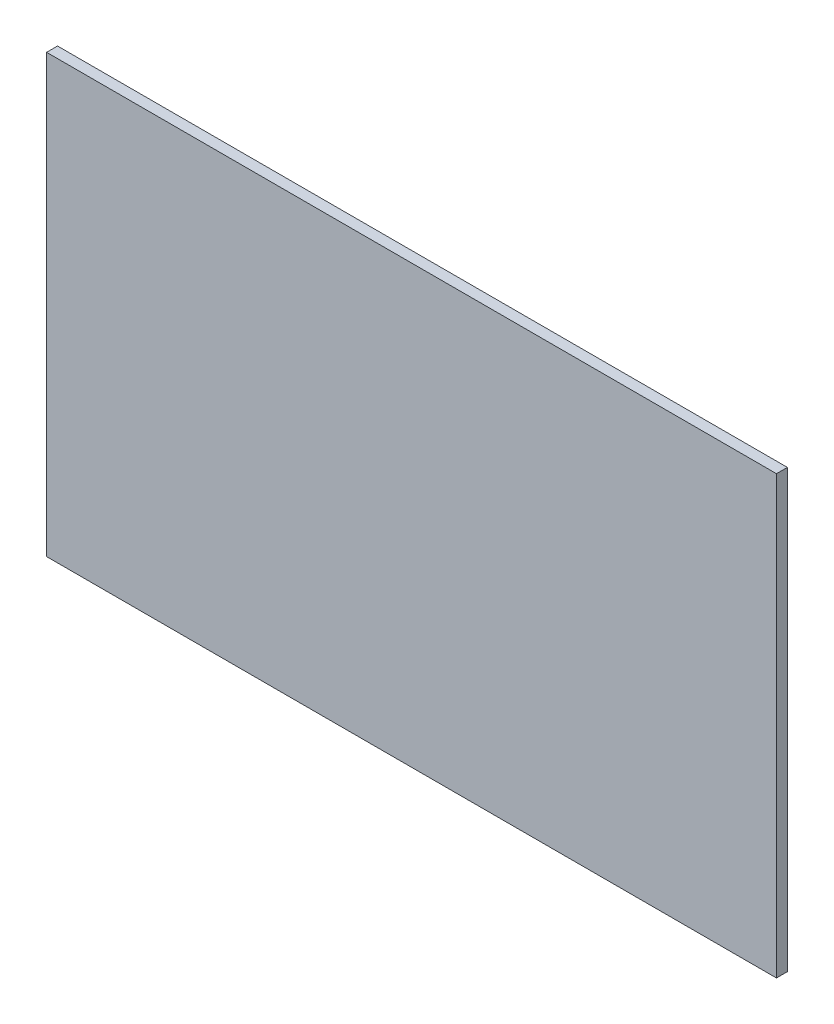
ISO-10303-21;
HEADER;
FILE_DESCRIPTION(('STEP AP214'),'2;1');
FILE_NAME('part.step','',(''),(''),'','','');
FILE_SCHEMA(('AUTOMOTIVE_DESIGN { 1 0 10303 214 1 1 1 1 }'));
ENDSEC;
DATA;
#1=APPLICATION_CONTEXT('core data for automotive mechanical design processes');
#2=APPLICATION_PROTOCOL_DEFINITION('international standard','automotive_design',2000,#1);
#3=PRODUCT_CONTEXT('',#1,'mechanical');
#4=PRODUCT('Part','Part','',(#3));
#5=PRODUCT_RELATED_PRODUCT_CATEGORY('part','',(#4));
#6=PRODUCT_DEFINITION_FORMATION('','',#4);
#7=PRODUCT_DEFINITION_CONTEXT('part definition',#1,'design');
#8=PRODUCT_DEFINITION('design','',#6,#7);
#9=PRODUCT_DEFINITION_SHAPE('','',#8);
#10=(LENGTH_UNIT() NAMED_UNIT(*) SI_UNIT(.MILLI.,.METRE.));
#11=(NAMED_UNIT(*) PLANE_ANGLE_UNIT() SI_UNIT($,.RADIAN.));
#12=(NAMED_UNIT(*) SI_UNIT($,.STERADIAN.) SOLID_ANGLE_UNIT());
#13=UNCERTAINTY_MEASURE_WITH_UNIT(LENGTH_MEASURE(1.E-05),#10,'distance_accuracy_value','');
#14=(GEOMETRIC_REPRESENTATION_CONTEXT(3) GLOBAL_UNCERTAINTY_ASSIGNED_CONTEXT((#13)) GLOBAL_UNIT_ASSIGNED_CONTEXT((#10,
#11,#12)) REPRESENTATION_CONTEXT('',''));
#15=CARTESIAN_POINT('',(0.,0.,0.));
#16=DIRECTION('',(0.,0.,1.));
#17=DIRECTION('',(1.,0.,0.));
#18=AXIS2_PLACEMENT_3D('',#15,#16,#17);
#19=CARTESIAN_POINT('',(-90.2766511100971,100.,0.));
#20=DIRECTION('',(1.,0.,0.));
#21=DIRECTION('',(0.,0.,-1.));
#22=AXIS2_PLACEMENT_3D('',#19,#20,#21);
#23=PLANE('',#22);
#24=DIRECTION('',(0.,0.,1.));
#25=VECTOR('',#24,1.);
#26=CARTESIAN_POINT('',(-90.2766511100971,0.,0.));
#27=LINE('',#26,#25);
#28=CARTESIAN_POINT('',(-90.2766511100971,0.,0.));
#29=VERTEX_POINT('',#28);
#30=CARTESIAN_POINT('',(-90.2766511100971,0.,2.49999999999997));
#31=VERTEX_POINT('',#30);
#32=EDGE_CURVE('E94',#29,#31,#27,.T.);
#33=ORIENTED_EDGE('',*,*,#32,.T.);
#34=DIRECTION('',(0.,-1.,0.));
#35=VECTOR('',#34,1.);
#36=CARTESIAN_POINT('',(-90.2766511100971,100.,2.49999999999997));
#37=LINE('',#36,#35);
#38=CARTESIAN_POINT('',(-90.2766511100971,100.,2.49999999999997));
#39=VERTEX_POINT('',#38);
#40=EDGE_CURVE('E11',#39,#31,#37,.T.);
#41=ORIENTED_EDGE('',*,*,#40,.F.);
#42=DIRECTION('',(0.,0.,1.));
#43=VECTOR('',#42,1.);
#44=CARTESIAN_POINT('',(-90.2766511100971,100.,0.));
#45=LINE('',#44,#43);
#46=CARTESIAN_POINT('',(-90.2766511100971,100.,0.));
#47=VERTEX_POINT('',#46);
#48=EDGE_CURVE('E82',#47,#39,#45,.T.);
#49=ORIENTED_EDGE('',*,*,#48,.F.);
#50=DIRECTION('',(0.,-1.,0.));
#51=VECTOR('',#50,1.);
#52=CARTESIAN_POINT('',(-90.2766511100971,100.,0.));
#53=LINE('',#52,#51);
#54=EDGE_CURVE('E90',#47,#29,#53,.T.);
#55=ORIENTED_EDGE('',*,*,#54,.T.);
#56=EDGE_LOOP('',(#33,#41,#49,#55));
#57=FACE_BOUND('',#56,.T.);
#58=ADVANCED_FACE('F31',(#57),#23,.F.);
#59=CARTESIAN_POINT('',(-90.2766511100971,100.,2.49999999999997));
#60=DIRECTION('',(0.,0.,-1.));
#61=DIRECTION('',(-1.,0.,0.));
#62=AXIS2_PLACEMENT_3D('',#59,#60,#61);
#63=PLANE('',#62);
#64=DIRECTION('',(1.,0.,0.));
#65=VECTOR('',#64,1.);
#66=CARTESIAN_POINT('',(-90.2766511100971,0.,2.49999999999997));
#67=LINE('',#66,#65);
#68=CARTESIAN_POINT('',(76.8412616079348,0.,2.49999999999997));
#69=VERTEX_POINT('',#68);
#70=EDGE_CURVE('E86',#31,#69,#67,.T.);
#71=ORIENTED_EDGE('',*,*,#70,.T.);
#72=DIRECTION('',(0.,-1.,0.));
#73=VECTOR('',#72,1.);
#74=CARTESIAN_POINT('',(76.8412616079348,100.,2.49999999999997));
#75=LINE('',#74,#73);
#76=CARTESIAN_POINT('',(76.8412616079348,100.,2.49999999999997));
#77=VERTEX_POINT('',#76);
#78=EDGE_CURVE('E39',#77,#69,#75,.T.);
#79=ORIENTED_EDGE('',*,*,#78,.F.);
#80=DIRECTION('',(1.,0.,0.));
#81=VECTOR('',#80,1.);
#82=CARTESIAN_POINT('',(-90.2766511100971,100.,2.49999999999997));
#83=LINE('',#82,#81);
#84=EDGE_CURVE('E77',#39,#77,#83,.T.);
#85=ORIENTED_EDGE('',*,*,#84,.F.);
#86=ORIENTED_EDGE('',*,*,#40,.T.);
#87=EDGE_LOOP('',(#71,#79,#85,#86));
#88=FACE_BOUND('',#87,.T.);
#89=ADVANCED_FACE('F85',(#88),#63,.F.);
#90=CARTESIAN_POINT('',(76.8412616079348,100.,0.));
#91=DIRECTION('',(-1.,0.,0.));
#92=DIRECTION('',(0.,0.,1.));
#93=AXIS2_PLACEMENT_3D('',#90,#91,#92);
#94=PLANE('',#93);
#95=DIRECTION('',(0.,0.,-1.));
#96=VECTOR('',#95,1.);
#97=CARTESIAN_POINT('',(76.8412616079348,0.,0.));
#98=LINE('',#97,#96);
#99=CARTESIAN_POINT('',(76.8412616079348,0.,0.));
#100=VERTEX_POINT('',#99);
#101=EDGE_CURVE('E64',#69,#100,#98,.T.);
#102=ORIENTED_EDGE('',*,*,#101,.T.);
#103=DIRECTION('',(0.,-1.,0.));
#104=VECTOR('',#103,1.);
#105=CARTESIAN_POINT('',(76.8412616079348,100.,0.));
#106=LINE('',#105,#104);
#107=CARTESIAN_POINT('',(76.8412616079348,100.,0.));
#108=VERTEX_POINT('',#107);
#109=EDGE_CURVE('E87',#108,#100,#106,.T.);
#110=ORIENTED_EDGE('',*,*,#109,.F.);
#111=DIRECTION('',(0.,0.,-1.));
#112=VECTOR('',#111,1.);
#113=CARTESIAN_POINT('',(76.8412616079348,100.,0.));
#114=LINE('',#113,#112);
#115=EDGE_CURVE('E80',#77,#108,#114,.T.);
#116=ORIENTED_EDGE('',*,*,#115,.F.);
#117=ORIENTED_EDGE('',*,*,#78,.T.);
#118=EDGE_LOOP('',(#102,#110,#116,#117));
#119=FACE_BOUND('',#118,.T.);
#120=ADVANCED_FACE('F88',(#119),#94,.F.);
#121=CARTESIAN_POINT('',(-90.2766511100971,100.,0.));
#122=DIRECTION('',(0.,0.,1.));
#123=DIRECTION('',(1.,0.,0.));
#124=AXIS2_PLACEMENT_3D('',#121,#122,#123);
#125=PLANE('',#124);
#126=DIRECTION('',(-1.,0.,0.));
#127=VECTOR('',#126,1.);
#128=CARTESIAN_POINT('',(-90.2766511100971,0.,0.));
#129=LINE('',#128,#127);
#130=EDGE_CURVE('E70',#100,#29,#129,.T.);
#131=ORIENTED_EDGE('',*,*,#130,.T.);
#132=ORIENTED_EDGE('',*,*,#54,.F.);
#133=DIRECTION('',(-1.,0.,0.));
#134=VECTOR('',#133,1.);
#135=CARTESIAN_POINT('',(-90.2766511100971,100.,0.));
#136=LINE('',#135,#134);
#137=EDGE_CURVE('E47',#108,#47,#136,.T.);
#138=ORIENTED_EDGE('',*,*,#137,.F.);
#139=ORIENTED_EDGE('',*,*,#109,.T.);
#140=EDGE_LOOP('',(#131,#132,#138,#139));
#141=FACE_BOUND('',#140,.T.);
#142=ADVANCED_FACE('F101',(#141),#125,.F.);
#143=CARTESIAN_POINT('',(-90.2766511100971,100.,2.49999999999997));
#144=DIRECTION('',(0.,1.,0.));
#145=DIRECTION('',(0.,0.,1.));
#146=AXIS2_PLACEMENT_3D('',#143,#144,#145);
#147=PLANE('',#146);
#148=ORIENTED_EDGE('',*,*,#48,.T.);
#149=ORIENTED_EDGE('',*,*,#84,.T.);
#150=ORIENTED_EDGE('',*,*,#115,.T.);
#151=ORIENTED_EDGE('',*,*,#137,.T.);
#152=EDGE_LOOP('',(#148,#149,#150,#151));
#153=FACE_BOUND('',#152,.T.);
#154=ADVANCED_FACE('F78',(#153),#147,.T.);
#155=CARTESIAN_POINT('',(-90.2766511100971,0.,2.49999999999997));
#156=DIRECTION('',(0.,1.,0.));
#157=DIRECTION('',(0.,0.,1.));
#158=AXIS2_PLACEMENT_3D('',#155,#156,#157);
#159=PLANE('',#158);
#160=ORIENTED_EDGE('',*,*,#32,.F.);
#161=ORIENTED_EDGE('',*,*,#130,.F.);
#162=ORIENTED_EDGE('',*,*,#101,.F.);
#163=ORIENTED_EDGE('',*,*,#70,.F.);
#164=EDGE_LOOP('',(#160,#161,#162,#163));
#165=FACE_BOUND('',#164,.T.);
#166=ADVANCED_FACE('F104',(#165),#159,.F.);
#167=CLOSED_SHELL('',(#58,#89,#120,#142,#154,#166));
#168=MANIFOLD_SOLID_BREP('B2',#167);
#169=ADVANCED_BREP_SHAPE_REPRESENTATION('',(#18,#168),#14);
#170=SHAPE_DEFINITION_REPRESENTATION(#9,#169);
ENDSEC;
END-ISO-10303-21;
